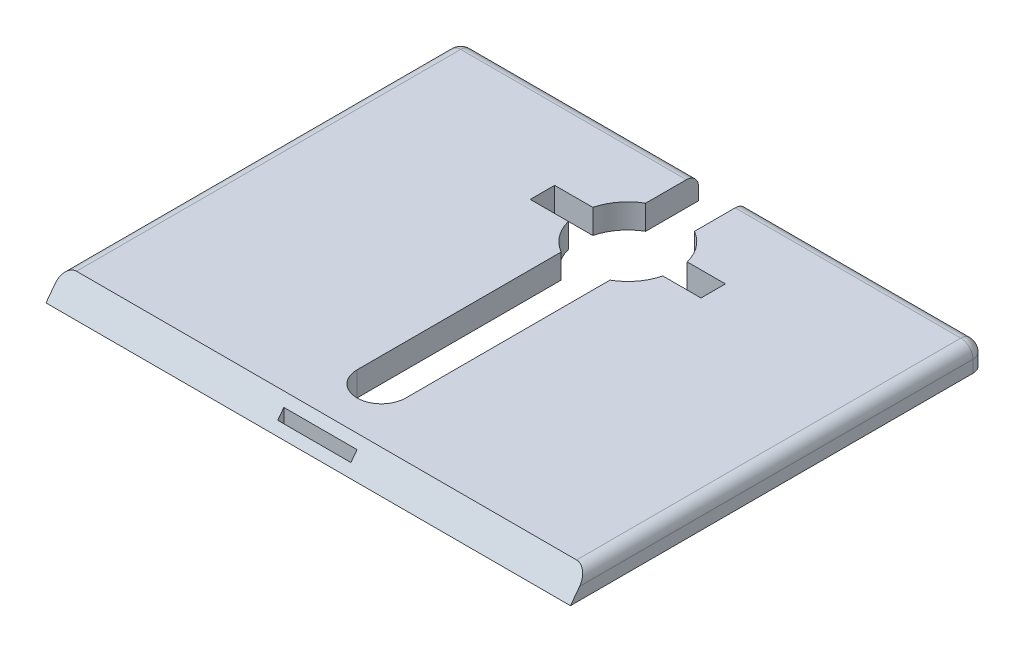
ISO-10303-21;
HEADER;
FILE_DESCRIPTION(('STEP AP214'),'2;1');
FILE_NAME('part.step','',(''),(''),'','','');
FILE_SCHEMA(('AUTOMOTIVE_DESIGN { 1 0 10303 214 1 1 1 1 }'));
ENDSEC;
DATA;
#1=APPLICATION_CONTEXT('core data for automotive mechanical design processes');
#2=APPLICATION_PROTOCOL_DEFINITION('international standard','automotive_design',2000,#1);
#3=PRODUCT_CONTEXT('',#1,'mechanical');
#4=PRODUCT('Part','Part','',(#3));
#5=PRODUCT_RELATED_PRODUCT_CATEGORY('part','',(#4));
#6=PRODUCT_DEFINITION_FORMATION('','',#4);
#7=PRODUCT_DEFINITION_CONTEXT('part definition',#1,'design');
#8=PRODUCT_DEFINITION('design','',#6,#7);
#9=PRODUCT_DEFINITION_SHAPE('','',#8);
#10=(LENGTH_UNIT() NAMED_UNIT(*) SI_UNIT(.MILLI.,.METRE.));
#11=(NAMED_UNIT(*) PLANE_ANGLE_UNIT() SI_UNIT($,.RADIAN.));
#12=(NAMED_UNIT(*) SI_UNIT($,.STERADIAN.) SOLID_ANGLE_UNIT());
#13=UNCERTAINTY_MEASURE_WITH_UNIT(LENGTH_MEASURE(1.E-05),#10,'distance_accuracy_value','');
#14=(GEOMETRIC_REPRESENTATION_CONTEXT(3) GLOBAL_UNCERTAINTY_ASSIGNED_CONTEXT((#13)) GLOBAL_UNIT_ASSIGNED_CONTEXT((#10,
#11,#12)) REPRESENTATION_CONTEXT('',''));
#15=CARTESIAN_POINT('',(0.,0.,0.));
#16=DIRECTION('',(0.,0.,1.));
#17=DIRECTION('',(1.,0.,0.));
#18=AXIS2_PLACEMENT_3D('',#15,#16,#17);
#19=CARTESIAN_POINT('',(-10.75,1.,-8.5));
#20=DIRECTION('',(0.,0.,1.));
#21=DIRECTION('',(1.,0.,0.));
#22=AXIS2_PLACEMENT_3D('',#19,#20,#21);
#23=PLANE('',#22);
#24=DIRECTION('',(-1.,0.,0.));
#25=VECTOR('',#24,1.);
#26=CARTESIAN_POINT('',(-10.75,0.,-8.5));
#27=LINE('',#26,#25);
#28=CARTESIAN_POINT('',(10.25,0.,-8.5));
#29=VERTEX_POINT('',#28);
#30=CARTESIAN_POINT('',(1.,0.,-8.5));
#31=VERTEX_POINT('',#30);
#32=EDGE_CURVE('E437',#29,#31,#27,.T.);
#33=ORIENTED_EDGE('',*,*,#32,.T.);
#34=DIRECTION('',(0.,1.,0.));
#35=VECTOR('',#34,1.);
#36=CARTESIAN_POINT('',(1.,-16.1245154965971,-8.5));
#37=LINE('',#36,#35);
#38=CARTESIAN_POINT('',(1.,0.5,-8.5));
#39=VERTEX_POINT('',#38);
#40=EDGE_CURVE('E273',#31,#39,#37,.T.);
#41=ORIENTED_EDGE('',*,*,#40,.T.);
#42=DIRECTION('',(-1.,0.,0.));
#43=VECTOR('',#42,1.);
#44=CARTESIAN_POINT('',(-10.75,0.5,-8.5));
#45=LINE('',#44,#43);
#46=CARTESIAN_POINT('',(10.25,0.5,-8.5));
#47=VERTEX_POINT('',#46);
#48=EDGE_CURVE('E463',#39,#47,#45,.F.);
#49=ORIENTED_EDGE('',*,*,#48,.T.);
#50=DIRECTION('',(0.,-1.,0.));
#51=VECTOR('',#50,1.);
#52=CARTESIAN_POINT('',(10.25,1.,-8.5));
#53=LINE('',#52,#51);
#54=EDGE_CURVE('E509',#47,#29,#53,.T.);
#55=ORIENTED_EDGE('',*,*,#54,.T.);
#56=EDGE_LOOP('',(#33,#41,#49,#55));
#57=FACE_BOUND('',#56,.T.);
#58=ADVANCED_FACE('F41',(#57),#23,.F.);
#59=CARTESIAN_POINT('',(0.,0.5,-8.));
#60=DIRECTION('',(-1.,0.,0.));
#61=DIRECTION('',(0.,0.,1.));
#62=AXIS2_PLACEMENT_3D('',#59,#60,#61);
#63=CYLINDRICAL_SURFACE('',#62,0.5);
#64=CARTESIAN_POINT('',(-1.,0.5,-8.));
#65=DIRECTION('',(-1.,0.,0.));
#66=DIRECTION('',(0.,0.,1.));
#67=AXIS2_PLACEMENT_3D('',#64,#65,#66);
#68=CIRCLE('',#67,0.5);
#69=CARTESIAN_POINT('',(-1.,0.5,-8.5));
#70=VERTEX_POINT('',#69);
#71=CARTESIAN_POINT('',(-1.,1.,-8.));
#72=VERTEX_POINT('',#71);
#73=EDGE_CURVE('E292',#70,#72,#68,.F.);
#74=ORIENTED_EDGE('',*,*,#73,.F.);
#75=CARTESIAN_POINT('',(-10.25,0.5,-8.5));
#76=VERTEX_POINT('',#75);
#77=EDGE_CURVE('E464',#76,#70,#45,.F.);
#78=ORIENTED_EDGE('',*,*,#77,.F.);
#79=CARTESIAN_POINT('',(-10.25,0.5,-8.));
#80=DIRECTION('',(-1.,0.,0.));
#81=DIRECTION('',(0.,0.,1.));
#82=AXIS2_PLACEMENT_3D('',#79,#80,#81);
#83=CIRCLE('',#82,0.5);
#84=CARTESIAN_POINT('',(-10.25,1.,-8.));
#85=VERTEX_POINT('',#84);
#86=EDGE_CURVE('E495',#76,#85,#83,.F.);
#87=ORIENTED_EDGE('',*,*,#86,.T.);
#88=DIRECTION('',(-1.,0.,0.));
#89=VECTOR('',#88,1.);
#90=CARTESIAN_POINT('',(0.,1.,-8.));
#91=LINE('',#90,#89);
#92=EDGE_CURVE('E451',#72,#85,#91,.T.);
#93=ORIENTED_EDGE('',*,*,#92,.F.);
#94=EDGE_LOOP('',(#74,#78,#87,#93));
#95=FACE_BOUND('',#94,.T.);
#96=ADVANCED_FACE('F625',(#95),#63,.T.);
#97=CARTESIAN_POINT('',(0.,-8.06225774829855,-4.6));
#98=DIRECTION('',(0.,1.,0.));
#99=DIRECTION('',(0.,0.,1.));
#100=AXIS2_PLACEMENT_3D('',#97,#98,#99);
#101=CYLINDRICAL_SURFACE('',#100,2.);
#102=CARTESIAN_POINT('',(0.,1.,-4.6));
#103=DIRECTION('',(0.,1.,0.));
#104=DIRECTION('',(0.,0.,1.));
#105=AXIS2_PLACEMENT_3D('',#102,#103,#104);
#106=CIRCLE('',#105,2.);
#107=CARTESIAN_POINT('',(-1.93649167310371,1.,-4.1));
#108=VERTEX_POINT('',#107);
#109=CARTESIAN_POINT('',(-1.,1.,-2.86794919243112));
#110=VERTEX_POINT('',#109);
#111=EDGE_CURVE('E327',#108,#110,#106,.T.);
#112=ORIENTED_EDGE('',*,*,#111,.T.);
#113=DIRECTION('',(0.,1.,0.));
#114=VECTOR('',#113,1.);
#115=CARTESIAN_POINT('',(-1.,-8.06225774829855,-2.86794919243112));
#116=LINE('',#115,#114);
#117=CARTESIAN_POINT('',(-1.,0.,-2.86794919243112));
#118=VERTEX_POINT('',#117);
#119=EDGE_CURVE('E289',#110,#118,#116,.F.);
#120=ORIENTED_EDGE('',*,*,#119,.T.);
#121=CARTESIAN_POINT('',(0.,0.,-4.6));
#122=DIRECTION('',(0.,-1.,0.));
#123=DIRECTION('',(0.,0.,-1.));
#124=AXIS2_PLACEMENT_3D('',#121,#122,#123);
#125=CIRCLE('',#124,2.);
#126=CARTESIAN_POINT('',(-1.93649167310371,0.,-4.1));
#127=VERTEX_POINT('',#126);
#128=EDGE_CURVE('E261',#127,#118,#125,.F.);
#129=ORIENTED_EDGE('',*,*,#128,.F.);
#130=DIRECTION('',(0.,1.,0.));
#131=VECTOR('',#130,1.);
#132=CARTESIAN_POINT('',(-1.93649167310371,-8.06225774829855,-4.1));
#133=LINE('',#132,#131);
#134=EDGE_CURVE('E342',#127,#108,#133,.T.);
#135=ORIENTED_EDGE('',*,*,#134,.T.);
#136=EDGE_LOOP('',(#112,#120,#129,#135));
#137=FACE_BOUND('',#136,.T.);
#138=ADVANCED_FACE('F642',(#137),#101,.F.);
#139=CARTESIAN_POINT('',(0.,-8.06225774829855,-4.6));
#140=DIRECTION('',(0.,1.,0.));
#141=DIRECTION('',(0.,0.,1.));
#142=AXIS2_PLACEMENT_3D('',#139,#140,#141);
#143=CYLINDRICAL_SURFACE('',#142,2.);
#144=CARTESIAN_POINT('',(0.,0.,-4.6));
#145=DIRECTION('',(0.,-1.,0.));
#146=DIRECTION('',(0.,0.,-1.));
#147=AXIS2_PLACEMENT_3D('',#144,#145,#146);
#148=CIRCLE('',#147,2.);
#149=CARTESIAN_POINT('',(-1.,0.,-6.33205080756888));
#150=VERTEX_POINT('',#149);
#151=CARTESIAN_POINT('',(-1.93649167310371,0.,-5.1));
#152=VERTEX_POINT('',#151);
#153=EDGE_CURVE('E317',#150,#152,#148,.F.);
#154=ORIENTED_EDGE('',*,*,#153,.F.);
#155=DIRECTION('',(0.,1.,0.));
#156=VECTOR('',#155,1.);
#157=CARTESIAN_POINT('',(-1.,-8.06225774829855,-6.33205080756888));
#158=LINE('',#157,#156);
#159=CARTESIAN_POINT('',(-1.,1.,-6.33205080756888));
#160=VERTEX_POINT('',#159);
#161=EDGE_CURVE('E11',#150,#160,#158,.T.);
#162=ORIENTED_EDGE('',*,*,#161,.T.);
#163=CARTESIAN_POINT('',(0.,1.,-4.6));
#164=DIRECTION('',(0.,1.,0.));
#165=DIRECTION('',(0.,0.,1.));
#166=AXIS2_PLACEMENT_3D('',#163,#164,#165);
#167=CIRCLE('',#166,2.);
#168=CARTESIAN_POINT('',(-1.93649167310371,1.,-5.1));
#169=VERTEX_POINT('',#168);
#170=EDGE_CURVE('E312',#160,#169,#167,.T.);
#171=ORIENTED_EDGE('',*,*,#170,.T.);
#172=DIRECTION('',(0.,1.,0.));
#173=VECTOR('',#172,1.);
#174=CARTESIAN_POINT('',(-1.93649167310371,-8.06225774829855,-5.1));
#175=LINE('',#174,#173);
#176=EDGE_CURVE('E353',#152,#169,#175,.T.);
#177=ORIENTED_EDGE('',*,*,#176,.F.);
#178=EDGE_LOOP('',(#154,#162,#171,#177));
#179=FACE_BOUND('',#178,.T.);
#180=ADVANCED_FACE('F565',(#179),#143,.F.);
#181=CARTESIAN_POINT('',(10.75,1.,8.5));
#182=DIRECTION('',(-1.,0.,0.));
#183=DIRECTION('',(0.,0.,1.));
#184=AXIS2_PLACEMENT_3D('',#181,#182,#183);
#185=PLANE('',#184);
#186=DIRECTION('',(0.,0.,-1.));
#187=VECTOR('',#186,1.);
#188=CARTESIAN_POINT('',(10.75,0.,8.5));
#189=LINE('',#188,#187);
#190=CARTESIAN_POINT('',(10.75,0.,8.50000000000004));
#191=VERTEX_POINT('',#190);
#192=CARTESIAN_POINT('',(10.75,0.,-8.));
#193=VERTEX_POINT('',#192);
#194=EDGE_CURVE('E432',#191,#193,#189,.T.);
#195=ORIENTED_EDGE('',*,*,#194,.T.);
#196=DIRECTION('',(0.,-1.,0.));
#197=VECTOR('',#196,1.);
#198=CARTESIAN_POINT('',(10.75,1.,-8.));
#199=LINE('',#198,#197);
#200=CARTESIAN_POINT('',(10.75,0.5,-8.));
#201=VERTEX_POINT('',#200);
#202=EDGE_CURVE('E519',#193,#201,#199,.F.);
#203=ORIENTED_EDGE('',*,*,#202,.T.);
#204=DIRECTION('',(0.,0.,-1.));
#205=VECTOR('',#204,1.);
#206=CARTESIAN_POINT('',(10.75,0.5,8.5));
#207=LINE('',#206,#205);
#208=CARTESIAN_POINT('',(10.75,0.5,8.12500000000004));
#209=VERTEX_POINT('',#208);
#210=EDGE_CURVE('E460',#201,#209,#207,.F.);
#211=ORIENTED_EDGE('',*,*,#210,.T.);
#212=DIRECTION('',(0.,0.8,-0.6));
#213=VECTOR('',#212,1.);
#214=CARTESIAN_POINT('',(10.75,0.,8.50000000000004));
#215=LINE('',#214,#213);
#216=EDGE_CURVE('E419',#191,#209,#215,.T.);
#217=ORIENTED_EDGE('',*,*,#216,.F.);
#218=EDGE_LOOP('',(#195,#203,#211,#217));
#219=FACE_BOUND('',#218,.T.);
#220=ADVANCED_FACE('F634',(#219),#185,.F.);
#221=ORIENTED_EDGE('',*,*,#77,.T.);
#222=DIRECTION('',(0.,1.,0.));
#223=VECTOR('',#222,1.);
#224=CARTESIAN_POINT('',(-1.,-16.1245154965971,-8.5));
#225=LINE('',#224,#223);
#226=CARTESIAN_POINT('',(-1.,0.,-8.5));
#227=VERTEX_POINT('',#226);
#228=EDGE_CURVE('E278',#227,#70,#225,.T.);
#229=ORIENTED_EDGE('',*,*,#228,.F.);
#230=CARTESIAN_POINT('',(-10.25,0.,-8.5));
#231=VERTEX_POINT('',#230);
#232=EDGE_CURVE('E436',#227,#231,#27,.T.);
#233=ORIENTED_EDGE('',*,*,#232,.T.);
#234=DIRECTION('',(0.,-1.,0.));
#235=VECTOR('',#234,1.);
#236=CARTESIAN_POINT('',(-10.25,1.,-8.5));
#237=LINE('',#236,#235);
#238=EDGE_CURVE('E506',#231,#76,#237,.F.);
#239=ORIENTED_EDGE('',*,*,#238,.T.);
#240=EDGE_LOOP('',(#221,#229,#233,#239));
#241=FACE_BOUND('',#240,.T.);
#242=ADVANCED_FACE('F628',(#241),#23,.F.);
#243=CARTESIAN_POINT('',(-10.75,1.,8.5));
#244=DIRECTION('',(1.,0.,0.));
#245=DIRECTION('',(0.,0.,-1.));
#246=AXIS2_PLACEMENT_3D('',#243,#244,#245);
#247=PLANE('',#246);
#248=DIRECTION('',(0.,0.,1.));
#249=VECTOR('',#248,1.);
#250=CARTESIAN_POINT('',(-10.75,0.5,8.5));
#251=LINE('',#250,#249);
#252=CARTESIAN_POINT('',(-10.75,0.5,8.12500000000004));
#253=VERTEX_POINT('',#252);
#254=CARTESIAN_POINT('',(-10.75,0.5,-8.));
#255=VERTEX_POINT('',#254);
#256=EDGE_CURVE('E468',#253,#255,#251,.F.);
#257=ORIENTED_EDGE('',*,*,#256,.T.);
#258=DIRECTION('',(0.,-1.,0.));
#259=VECTOR('',#258,1.);
#260=CARTESIAN_POINT('',(-10.75,1.,-8.));
#261=LINE('',#260,#259);
#262=CARTESIAN_POINT('',(-10.75,0.,-8.));
#263=VERTEX_POINT('',#262);
#264=EDGE_CURVE('E522',#255,#263,#261,.T.);
#265=ORIENTED_EDGE('',*,*,#264,.T.);
#266=DIRECTION('',(0.,0.,1.));
#267=VECTOR('',#266,1.);
#268=CARTESIAN_POINT('',(-10.75,0.,8.5));
#269=LINE('',#268,#267);
#270=CARTESIAN_POINT('',(-10.75,0.,8.50000000000004));
#271=VERTEX_POINT('',#270);
#272=EDGE_CURVE('E441',#263,#271,#269,.T.);
#273=ORIENTED_EDGE('',*,*,#272,.T.);
#274=DIRECTION('',(0.,-0.8,0.6));
#275=VECTOR('',#274,1.);
#276=CARTESIAN_POINT('',(-10.75,0.,8.50000000000004));
#277=LINE('',#276,#275);
#278=EDGE_CURVE('E418',#253,#271,#277,.T.);
#279=ORIENTED_EDGE('',*,*,#278,.F.);
#280=EDGE_LOOP('',(#257,#265,#273,#279));
#281=FACE_BOUND('',#280,.T.);
#282=ADVANCED_FACE('F614',(#281),#247,.F.);
#283=CARTESIAN_POINT('',(0.,1.,0.));
#284=DIRECTION('',(0.,-1.,0.));
#285=DIRECTION('',(0.,0.,-1.));
#286=AXIS2_PLACEMENT_3D('',#283,#284,#285);
#287=PLANE('',#286);
#288=ORIENTED_EDGE('',*,*,#170,.F.);
#289=DIRECTION('',(0.,0.,1.));
#290=VECTOR('',#289,1.);
#291=CARTESIAN_POINT('',(-1.,1.,-8.5));
#292=LINE('',#291,#290);
#293=EDGE_CURVE('E555',#72,#160,#292,.T.);
#294=ORIENTED_EDGE('',*,*,#293,.F.);
#295=ORIENTED_EDGE('',*,*,#92,.T.);
#296=DIRECTION('',(0.,0.,1.));
#297=VECTOR('',#296,1.);
#298=CARTESIAN_POINT('',(-10.25,1.,0.));
#299=LINE('',#298,#297);
#300=CARTESIAN_POINT('',(-10.25,1.,7.75000000000004));
#301=VERTEX_POINT('',#300);
#302=EDGE_CURVE('E447',#85,#301,#299,.T.);
#303=ORIENTED_EDGE('',*,*,#302,.T.);
#304=DIRECTION('',(-1.,0.,0.));
#305=VECTOR('',#304,1.);
#306=CARTESIAN_POINT('',(12.,1.,7.75000000000004));
#307=LINE('',#306,#305);
#308=CARTESIAN_POINT('',(10.25,1.,7.75000000000004));
#309=VERTEX_POINT('',#308);
#310=EDGE_CURVE('E424',#309,#301,#307,.T.);
#311=ORIENTED_EDGE('',*,*,#310,.F.);
#312=DIRECTION('',(0.,0.,-1.));
#313=VECTOR('',#312,1.);
#314=CARTESIAN_POINT('',(10.25,1.,0.));
#315=LINE('',#314,#313);
#316=CARTESIAN_POINT('',(10.25,1.,-8.));
#317=VERTEX_POINT('',#316);
#318=EDGE_CURVE('E456',#309,#317,#315,.T.);
#319=ORIENTED_EDGE('',*,*,#318,.T.);
#320=CARTESIAN_POINT('',(1.,1.,-8.));
#321=VERTEX_POINT('',#320);
#322=EDGE_CURVE('E452',#317,#321,#91,.T.);
#323=ORIENTED_EDGE('',*,*,#322,.T.);
#324=DIRECTION('',(0.,0.,-1.));
#325=VECTOR('',#324,1.);
#326=CARTESIAN_POINT('',(1.,1.,-8.5));
#327=LINE('',#326,#325);
#328=CARTESIAN_POINT('',(1.,1.,-6.33205080756888));
#329=VERTEX_POINT('',#328);
#330=EDGE_CURVE('E266',#329,#321,#327,.T.);
#331=ORIENTED_EDGE('',*,*,#330,.F.);
#332=CARTESIAN_POINT('',(1.93649167310371,1.,-5.1));
#333=VERTEX_POINT('',#332);
#334=EDGE_CURVE('E307',#333,#329,#167,.T.);
#335=ORIENTED_EDGE('',*,*,#334,.F.);
#336=DIRECTION('',(1.,0.,0.));
#337=VECTOR('',#336,1.);
#338=CARTESIAN_POINT('',(0.,1.,-5.1));
#339=LINE('',#338,#337);
#340=CARTESIAN_POINT('',(3.5,1.,-5.1));
#341=VERTEX_POINT('',#340);
#342=EDGE_CURVE('E313',#333,#341,#339,.T.);
#343=ORIENTED_EDGE('',*,*,#342,.T.);
#344=DIRECTION('',(0.,0.,-1.));
#345=VECTOR('',#344,1.);
#346=CARTESIAN_POINT('',(3.5,1.,0.));
#347=LINE('',#346,#345);
#348=CARTESIAN_POINT('',(3.5,1.,-4.1));
#349=VERTEX_POINT('',#348);
#350=EDGE_CURVE('E319',#349,#341,#347,.T.);
#351=ORIENTED_EDGE('',*,*,#350,.F.);
#352=DIRECTION('',(1.,0.,0.));
#353=VECTOR('',#352,1.);
#354=CARTESIAN_POINT('',(0.,1.,-4.1));
#355=LINE('',#354,#353);
#356=CARTESIAN_POINT('',(1.93649167310371,1.,-4.1));
#357=VERTEX_POINT('',#356);
#358=EDGE_CURVE('E323',#357,#349,#355,.T.);
#359=ORIENTED_EDGE('',*,*,#358,.F.);
#360=CARTESIAN_POINT('',(1.,1.,-2.86794919243112));
#361=VERTEX_POINT('',#360);
#362=EDGE_CURVE('E331',#361,#357,#106,.T.);
#363=ORIENTED_EDGE('',*,*,#362,.F.);
#364=CARTESIAN_POINT('',(1.,1.,5.5));
#365=VERTEX_POINT('',#364);
#366=EDGE_CURVE('E57',#365,#361,#327,.T.);
#367=ORIENTED_EDGE('',*,*,#366,.F.);
#368=CARTESIAN_POINT('',(0.,1.,5.5));
#369=DIRECTION('',(0.,1.,0.));
#370=DIRECTION('',(0.,0.,1.));
#371=AXIS2_PLACEMENT_3D('',#368,#369,#370);
#372=CIRCLE('',#371,1.);
#373=CARTESIAN_POINT('',(-1.,1.,5.5));
#374=VERTEX_POINT('',#373);
#375=EDGE_CURVE('E553',#374,#365,#372,.T.);
#376=ORIENTED_EDGE('',*,*,#375,.F.);
#377=EDGE_CURVE('E251',#110,#374,#292,.T.);
#378=ORIENTED_EDGE('',*,*,#377,.F.);
#379=ORIENTED_EDGE('',*,*,#111,.F.);
#380=DIRECTION('',(1.,0.,0.));
#381=VECTOR('',#380,1.);
#382=CARTESIAN_POINT('',(0.,1.,-4.1));
#383=LINE('',#382,#381);
#384=CARTESIAN_POINT('',(-3.5,1.,-4.1));
#385=VERTEX_POINT('',#384);
#386=EDGE_CURVE('E332',#385,#108,#383,.T.);
#387=ORIENTED_EDGE('',*,*,#386,.F.);
#388=DIRECTION('',(0.,0.,-1.));
#389=VECTOR('',#388,1.);
#390=CARTESIAN_POINT('',(-3.5,1.,0.));
#391=LINE('',#390,#389);
#392=CARTESIAN_POINT('',(-3.5,1.,-5.1));
#393=VERTEX_POINT('',#392);
#394=EDGE_CURVE('E296',#385,#393,#391,.T.);
#395=ORIENTED_EDGE('',*,*,#394,.T.);
#396=DIRECTION('',(1.,0.,0.));
#397=VECTOR('',#396,1.);
#398=CARTESIAN_POINT('',(0.,1.,-5.1));
#399=LINE('',#398,#397);
#400=EDGE_CURVE('E302',#393,#169,#399,.T.);
#401=ORIENTED_EDGE('',*,*,#400,.T.);
#402=EDGE_LOOP('',(#288,#294,#295,#303,#311,#319,#323,#331,#335,#343,#351,#359,#363,#367,#376,
#378,#379,#387,#395,#401));
#403=FACE_BOUND('',#402,.T.);
#404=ADVANCED_FACE('F549',(#403),#287,.F.);
#405=CARTESIAN_POINT('',(0.,0.,0.));
#406=DIRECTION('',(0.,-1.,0.));
#407=DIRECTION('',(0.,0.,-1.));
#408=AXIS2_PLACEMENT_3D('',#405,#406,#407);
#409=PLANE('',#408);
#410=DIRECTION('',(0.,0.,1.));
#411=VECTOR('',#410,1.);
#412=CARTESIAN_POINT('',(-1.,0.,-8.5));
#413=LINE('',#412,#411);
#414=EDGE_CURVE('E253',#227,#150,#413,.T.);
#415=ORIENTED_EDGE('',*,*,#414,.T.);
#416=ORIENTED_EDGE('',*,*,#153,.T.);
#417=DIRECTION('',(1.,0.,0.));
#418=VECTOR('',#417,1.);
#419=CARTESIAN_POINT('',(0.,0.,-5.1));
#420=LINE('',#419,#418);
#421=CARTESIAN_POINT('',(-3.5,0.,-5.1));
#422=VERTEX_POINT('',#421);
#423=EDGE_CURVE('E345',#422,#152,#420,.T.);
#424=ORIENTED_EDGE('',*,*,#423,.F.);
#425=DIRECTION('',(0.,0.,-1.));
#426=VECTOR('',#425,1.);
#427=CARTESIAN_POINT('',(-3.5,0.,0.));
#428=LINE('',#427,#426);
#429=CARTESIAN_POINT('',(-3.5,0.,-4.1));
#430=VERTEX_POINT('',#429);
#431=EDGE_CURVE('E295',#430,#422,#428,.T.);
#432=ORIENTED_EDGE('',*,*,#431,.F.);
#433=DIRECTION('',(1.,0.,0.));
#434=VECTOR('',#433,1.);
#435=CARTESIAN_POINT('',(0.,0.,-4.1));
#436=LINE('',#435,#434);
#437=EDGE_CURVE('E300',#430,#127,#436,.T.);
#438=ORIENTED_EDGE('',*,*,#437,.T.);
#439=ORIENTED_EDGE('',*,*,#128,.T.);
#440=CARTESIAN_POINT('',(-1.,0.,5.5));
#441=VERTEX_POINT('',#440);
#442=EDGE_CURVE('E248',#118,#441,#413,.T.);
#443=ORIENTED_EDGE('',*,*,#442,.T.);
#444=CARTESIAN_POINT('',(0.,0.,5.5));
#445=DIRECTION('',(0.,-1.,0.));
#446=DIRECTION('',(0.,0.,-1.));
#447=AXIS2_PLACEMENT_3D('',#444,#445,#446);
#448=CIRCLE('',#447,1.);
#449=CARTESIAN_POINT('',(1.,0.,5.5));
#450=VERTEX_POINT('',#449);
#451=EDGE_CURVE('E234',#441,#450,#448,.F.);
#452=ORIENTED_EDGE('',*,*,#451,.T.);
#453=DIRECTION('',(0.,0.,-1.));
#454=VECTOR('',#453,1.);
#455=CARTESIAN_POINT('',(1.,0.,-8.5));
#456=LINE('',#455,#454);
#457=CARTESIAN_POINT('',(1.,0.,-2.86794919243112));
#458=VERTEX_POINT('',#457);
#459=EDGE_CURVE('E271',#450,#458,#456,.T.);
#460=ORIENTED_EDGE('',*,*,#459,.T.);
#461=CARTESIAN_POINT('',(1.93649167310371,0.,-4.1));
#462=VERTEX_POINT('',#461);
#463=EDGE_CURVE('E311',#458,#462,#125,.F.);
#464=ORIENTED_EDGE('',*,*,#463,.T.);
#465=DIRECTION('',(1.,0.,0.));
#466=VECTOR('',#465,1.);
#467=CARTESIAN_POINT('',(0.,0.,-4.1));
#468=LINE('',#467,#466);
#469=CARTESIAN_POINT('',(3.5,0.,-4.1));
#470=VERTEX_POINT('',#469);
#471=EDGE_CURVE('E362',#462,#470,#468,.T.);
#472=ORIENTED_EDGE('',*,*,#471,.T.);
#473=DIRECTION('',(0.,0.,-1.));
#474=VECTOR('',#473,1.);
#475=CARTESIAN_POINT('',(3.5,0.,0.));
#476=LINE('',#475,#474);
#477=CARTESIAN_POINT('',(3.5,0.,-5.1));
#478=VERTEX_POINT('',#477);
#479=EDGE_CURVE('E356',#470,#478,#476,.T.);
#480=ORIENTED_EDGE('',*,*,#479,.T.);
#481=DIRECTION('',(1.,0.,0.));
#482=VECTOR('',#481,1.);
#483=CARTESIAN_POINT('',(0.,0.,-5.1));
#484=LINE('',#483,#482);
#485=CARTESIAN_POINT('',(1.93649167310371,0.,-5.1));
#486=VERTEX_POINT('',#485);
#487=EDGE_CURVE('E336',#486,#478,#484,.T.);
#488=ORIENTED_EDGE('',*,*,#487,.F.);
#489=CARTESIAN_POINT('',(1.,0.,-6.33205080756888));
#490=VERTEX_POINT('',#489);
#491=EDGE_CURVE('E349',#486,#490,#148,.F.);
#492=ORIENTED_EDGE('',*,*,#491,.T.);
#493=EDGE_CURVE('E65',#490,#31,#456,.T.);
#494=ORIENTED_EDGE('',*,*,#493,.T.);
#495=ORIENTED_EDGE('',*,*,#32,.F.);
#496=CARTESIAN_POINT('',(10.25,0.,-8.));
#497=DIRECTION('',(0.,-1.,0.));
#498=DIRECTION('',(0.,0.,-1.));
#499=AXIS2_PLACEMENT_3D('',#496,#497,#498);
#500=CIRCLE('',#499,0.5);
#501=EDGE_CURVE('E516',#29,#193,#500,.T.);
#502=ORIENTED_EDGE('',*,*,#501,.T.);
#503=ORIENTED_EDGE('',*,*,#194,.F.);
#504=DIRECTION('',(1.,0.,0.));
#505=VECTOR('',#504,1.);
#506=CARTESIAN_POINT('',(-10.75,0.,8.5));
#507=LINE('',#506,#505);
#508=EDGE_CURVE('E444',#271,#191,#507,.T.);
#509=ORIENTED_EDGE('',*,*,#508,.F.);
#510=ORIENTED_EDGE('',*,*,#272,.F.);
#511=CARTESIAN_POINT('',(-10.25,0.,-8.));
#512=DIRECTION('',(0.,-1.,0.));
#513=DIRECTION('',(0.,0.,-1.));
#514=AXIS2_PLACEMENT_3D('',#511,#512,#513);
#515=CIRCLE('',#514,0.5);
#516=EDGE_CURVE('E512',#263,#231,#515,.T.);
#517=ORIENTED_EDGE('',*,*,#516,.T.);
#518=ORIENTED_EDGE('',*,*,#232,.F.);
#519=EDGE_LOOP('',(#415,#416,#424,#432,#438,#439,#443,#452,#460,#464,#472,#480,#488,#492,#494,
#495,#502,#503,#509,#510,#517,#518));
#520=FACE_BOUND('',#519,.T.);
#521=DIRECTION('',(-1.,0.,0.));
#522=VECTOR('',#521,1.);
#523=CARTESIAN_POINT('',(-1.5,0.,8.00000000000004));
#524=LINE('',#523,#522);
#525=CARTESIAN_POINT('',(1.5,0.,8.00000000000004));
#526=VERTEX_POINT('',#525);
#527=CARTESIAN_POINT('',(-1.5,0.,8.00000000000004));
#528=VERTEX_POINT('',#527);
#529=EDGE_CURVE('E386',#526,#528,#524,.T.);
#530=ORIENTED_EDGE('',*,*,#529,.T.);
#531=DIRECTION('',(0.,0.,1.));
#532=VECTOR('',#531,1.);
#533=CARTESIAN_POINT('',(-1.5,0.,8.25000000000004));
#534=LINE('',#533,#532);
#535=CARTESIAN_POINT('',(-1.5,0.,8.25000000000004));
#536=VERTEX_POINT('',#535);
#537=EDGE_CURVE('E403',#528,#536,#534,.T.);
#538=ORIENTED_EDGE('',*,*,#537,.T.);
#539=DIRECTION('',(1.,0.,0.));
#540=VECTOR('',#539,1.);
#541=CARTESIAN_POINT('',(-1.5,0.,8.25000000000004));
#542=LINE('',#541,#540);
#543=CARTESIAN_POINT('',(1.5,0.,8.25000000000004));
#544=VERTEX_POINT('',#543);
#545=EDGE_CURVE('E398',#536,#544,#542,.T.);
#546=ORIENTED_EDGE('',*,*,#545,.T.);
#547=DIRECTION('',(0.,0.,-1.));
#548=VECTOR('',#547,1.);
#549=CARTESIAN_POINT('',(1.5,0.,8.25000000000004));
#550=LINE('',#549,#548);
#551=EDGE_CURVE('E392',#544,#526,#550,.T.);
#552=ORIENTED_EDGE('',*,*,#551,.T.);
#553=EDGE_LOOP('',(#530,#538,#546,#552));
#554=FACE_BOUND('',#553,.T.);
#555=ADVANCED_FACE('F257',(#520,#554),#409,.T.);
#556=CARTESIAN_POINT('',(-10.25,0.5,0.));
#557=DIRECTION('',(0.,0.,1.));
#558=DIRECTION('',(1.,0.,0.));
#559=AXIS2_PLACEMENT_3D('',#556,#557,#558);
#560=CYLINDRICAL_SURFACE('',#559,0.5);
#561=ORIENTED_EDGE('',*,*,#302,.F.);
#562=CARTESIAN_POINT('',(-10.25,0.5,-8.));
#563=DIRECTION('',(0.,0.,1.));
#564=DIRECTION('',(1.,0.,0.));
#565=AXIS2_PLACEMENT_3D('',#562,#563,#564);
#566=CIRCLE('',#565,0.5);
#567=EDGE_CURVE('E503',#85,#255,#566,.T.);
#568=ORIENTED_EDGE('',*,*,#567,.T.);
#569=ORIENTED_EDGE('',*,*,#256,.F.);
#570=CARTESIAN_POINT('',(-10.25,0.5,8.12500000000004));
#571=DIRECTION('',(0.,-0.6,-0.8));
#572=DIRECTION('',(0.,-0.8,0.6));
#573=AXIS2_PLACEMENT_3D('',#570,#571,#572);
#574=ELLIPSE('',#573,0.625,0.5);
#575=EDGE_CURVE('E423',#301,#253,#574,.F.);
#576=ORIENTED_EDGE('',*,*,#575,.F.);
#577=EDGE_LOOP('',(#561,#568,#569,#576));
#578=FACE_BOUND('',#577,.T.);
#579=ADVANCED_FACE('F610',(#578),#560,.T.);
#580=CARTESIAN_POINT('',(1.,0.5,-8.));
#581=DIRECTION('',(1.,0.,0.));
#582=DIRECTION('',(0.,0.,-1.));
#583=AXIS2_PLACEMENT_3D('',#580,#581,#582);
#584=CIRCLE('',#583,0.5);
#585=EDGE_CURVE('E286',#321,#39,#584,.F.);
#586=ORIENTED_EDGE('',*,*,#585,.F.);
#587=ORIENTED_EDGE('',*,*,#322,.F.);
#588=CARTESIAN_POINT('',(10.25,0.5,-8.));
#589=DIRECTION('',(-1.,0.,0.));
#590=DIRECTION('',(0.,0.,1.));
#591=AXIS2_PLACEMENT_3D('',#588,#589,#590);
#592=CIRCLE('',#591,0.5);
#593=EDGE_CURVE('E499',#317,#47,#592,.T.);
#594=ORIENTED_EDGE('',*,*,#593,.T.);
#595=ORIENTED_EDGE('',*,*,#48,.F.);
#596=EDGE_LOOP('',(#586,#587,#594,#595));
#597=FACE_BOUND('',#596,.T.);
#598=ADVANCED_FACE('F588',(#597),#63,.T.);
#599=CARTESIAN_POINT('',(10.25,0.5,0.));
#600=DIRECTION('',(0.,0.,-1.));
#601=DIRECTION('',(-1.,0.,0.));
#602=AXIS2_PLACEMENT_3D('',#599,#600,#601);
#603=CYLINDRICAL_SURFACE('',#602,0.5);
#604=ORIENTED_EDGE('',*,*,#210,.F.);
#605=CARTESIAN_POINT('',(10.25,0.5,-8.));
#606=DIRECTION('',(0.,0.,-1.));
#607=DIRECTION('',(-1.,0.,0.));
#608=AXIS2_PLACEMENT_3D('',#605,#606,#607);
#609=CIRCLE('',#608,0.5);
#610=EDGE_CURVE('E491',#201,#317,#609,.F.);
#611=ORIENTED_EDGE('',*,*,#610,.T.);
#612=ORIENTED_EDGE('',*,*,#318,.F.);
#613=CARTESIAN_POINT('',(10.25,0.5,8.12500000000004));
#614=DIRECTION('',(0.,-0.6,-0.8));
#615=DIRECTION('',(0.,0.8,-0.6));
#616=AXIS2_PLACEMENT_3D('',#613,#614,#615);
#617=ELLIPSE('',#616,0.625,0.5);
#618=EDGE_CURVE('E472',#209,#309,#617,.F.);
#619=ORIENTED_EDGE('',*,*,#618,.F.);
#620=EDGE_LOOP('',(#604,#611,#612,#619));
#621=FACE_BOUND('',#620,.T.);
#622=ADVANCED_FACE('F600',(#621),#603,.T.);
#623=CARTESIAN_POINT('',(12.,0.,8.50000000000004));
#624=DIRECTION('',(0.,-0.6,-0.8));
#625=DIRECTION('',(0.,0.8,-0.6));
#626=AXIS2_PLACEMENT_3D('',#623,#624,#625);
#627=PLANE('',#626);
#628=DIRECTION('',(0.,0.8,-0.6));
#629=VECTOR('',#628,1.);
#630=CARTESIAN_POINT('',(-1.5,0.,8.50000000000004));
#631=LINE('',#630,#629);
#632=CARTESIAN_POINT('',(-1.5,0.333333333333334,8.25000000000004));
#633=VERTEX_POINT('',#632);
#634=CARTESIAN_POINT('',(-1.5,0.666666666666668,8.00000000000004));
#635=VERTEX_POINT('',#634);
#636=EDGE_CURVE('E483',#633,#635,#631,.T.);
#637=ORIENTED_EDGE('',*,*,#636,.T.);
#638=DIRECTION('',(1.,0.,0.));
#639=VECTOR('',#638,1.);
#640=CARTESIAN_POINT('',(12.,0.666666666666667,8.00000000000004));
#641=LINE('',#640,#639);
#642=CARTESIAN_POINT('',(1.5,0.666666666666668,8.00000000000004));
#643=VERTEX_POINT('',#642);
#644=EDGE_CURVE('E487',#635,#643,#641,.T.);
#645=ORIENTED_EDGE('',*,*,#644,.T.);
#646=DIRECTION('',(0.,-0.8,0.6));
#647=VECTOR('',#646,1.);
#648=CARTESIAN_POINT('',(1.5,0.,8.50000000000004));
#649=LINE('',#648,#647);
#650=CARTESIAN_POINT('',(1.5,0.333333333333334,8.25000000000004));
#651=VERTEX_POINT('',#650);
#652=EDGE_CURVE('E475',#643,#651,#649,.T.);
#653=ORIENTED_EDGE('',*,*,#652,.T.);
#654=DIRECTION('',(-1.,0.,0.));
#655=VECTOR('',#654,1.);
#656=CARTESIAN_POINT('',(12.,0.333333333333334,8.25000000000004));
#657=LINE('',#656,#655);
#658=EDGE_CURVE('E479',#651,#633,#657,.T.);
#659=ORIENTED_EDGE('',*,*,#658,.T.);
#660=EDGE_LOOP('',(#637,#645,#653,#659));
#661=FACE_BOUND('',#660,.T.);
#662=ORIENTED_EDGE('',*,*,#575,.T.);
#663=ORIENTED_EDGE('',*,*,#278,.T.);
#664=ORIENTED_EDGE('',*,*,#508,.T.);
#665=ORIENTED_EDGE('',*,*,#216,.T.);
#666=ORIENTED_EDGE('',*,*,#618,.T.);
#667=ORIENTED_EDGE('',*,*,#310,.T.);
#668=EDGE_LOOP('',(#662,#663,#664,#665,#666,#667));
#669=FACE_BOUND('',#668,.T.);
#670=ADVANCED_FACE('F606',(#661,#669),#627,.F.);
#671=CARTESIAN_POINT('',(-1.5,-3.01039864469807,8.00000000000004));
#672=DIRECTION('',(0.,0.,-1.));
#673=DIRECTION('',(-1.,0.,0.));
#674=AXIS2_PLACEMENT_3D('',#671,#672,#673);
#675=PLANE('',#674);
#676=DIRECTION('',(0.,1.,0.));
#677=VECTOR('',#676,1.);
#678=CARTESIAN_POINT('',(-1.5,-3.01039864469807,8.00000000000004));
#679=LINE('',#678,#677);
#680=EDGE_CURVE('E390',#528,#635,#679,.T.);
#681=ORIENTED_EDGE('',*,*,#680,.F.);
#682=ORIENTED_EDGE('',*,*,#529,.F.);
#683=DIRECTION('',(0.,1.,0.));
#684=VECTOR('',#683,1.);
#685=CARTESIAN_POINT('',(1.5,-3.01039864469807,8.00000000000004));
#686=LINE('',#685,#684);
#687=EDGE_CURVE('E396',#526,#643,#686,.T.);
#688=ORIENTED_EDGE('',*,*,#687,.T.);
#689=ORIENTED_EDGE('',*,*,#644,.F.);
#690=EDGE_LOOP('',(#681,#682,#688,#689));
#691=FACE_BOUND('',#690,.T.);
#692=ADVANCED_FACE('F659',(#691),#675,.F.);
#693=CARTESIAN_POINT('',(-1.5,-3.01039864469807,8.25000000000004));
#694=DIRECTION('',(-1.,0.,0.));
#695=DIRECTION('',(0.,0.,1.));
#696=AXIS2_PLACEMENT_3D('',#693,#694,#695);
#697=PLANE('',#696);
#698=DIRECTION('',(0.,1.,0.));
#699=VECTOR('',#698,1.);
#700=CARTESIAN_POINT('',(-1.5,-3.01039864469807,8.25000000000004));
#701=LINE('',#700,#699);
#702=EDGE_CURVE('E402',#536,#633,#701,.T.);
#703=ORIENTED_EDGE('',*,*,#702,.F.);
#704=ORIENTED_EDGE('',*,*,#537,.F.);
#705=ORIENTED_EDGE('',*,*,#680,.T.);
#706=ORIENTED_EDGE('',*,*,#636,.F.);
#707=EDGE_LOOP('',(#703,#704,#705,#706));
#708=FACE_BOUND('',#707,.T.);
#709=ADVANCED_FACE('F663',(#708),#697,.F.);
#710=CARTESIAN_POINT('',(-1.5,-3.01039864469807,8.25000000000004));
#711=DIRECTION('',(0.,0.,1.));
#712=DIRECTION('',(1.,0.,0.));
#713=AXIS2_PLACEMENT_3D('',#710,#711,#712);
#714=PLANE('',#713);
#715=DIRECTION('',(0.,1.,0.));
#716=VECTOR('',#715,1.);
#717=CARTESIAN_POINT('',(1.5,-3.01039864469807,8.25000000000004));
#718=LINE('',#717,#716);
#719=EDGE_CURVE('E397',#544,#651,#718,.T.);
#720=ORIENTED_EDGE('',*,*,#719,.F.);
#721=ORIENTED_EDGE('',*,*,#545,.F.);
#722=ORIENTED_EDGE('',*,*,#702,.T.);
#723=ORIENTED_EDGE('',*,*,#658,.F.);
#724=EDGE_LOOP('',(#720,#721,#722,#723));
#725=FACE_BOUND('',#724,.T.);
#726=ADVANCED_FACE('F667',(#725),#714,.F.);
#727=CARTESIAN_POINT('',(1.5,-3.01039864469807,8.25000000000004));
#728=DIRECTION('',(1.,0.,0.));
#729=DIRECTION('',(0.,0.,-1.));
#730=AXIS2_PLACEMENT_3D('',#727,#728,#729);
#731=PLANE('',#730);
#732=ORIENTED_EDGE('',*,*,#687,.F.);
#733=ORIENTED_EDGE('',*,*,#551,.F.);
#734=ORIENTED_EDGE('',*,*,#719,.T.);
#735=ORIENTED_EDGE('',*,*,#652,.F.);
#736=EDGE_LOOP('',(#732,#733,#734,#735));
#737=FACE_BOUND('',#736,.T.);
#738=ADVANCED_FACE('F671',(#737),#731,.F.);
#739=CARTESIAN_POINT('',(10.25,1.,-8.));
#740=DIRECTION('',(0.,-1.,0.));
#741=DIRECTION('',(0.,0.,-1.));
#742=AXIS2_PLACEMENT_3D('',#739,#740,#741);
#743=CYLINDRICAL_SURFACE('',#742,0.5);
#744=ORIENTED_EDGE('',*,*,#501,.F.);
#745=ORIENTED_EDGE('',*,*,#54,.F.);
#746=CARTESIAN_POINT('',(10.25,0.5,-8.));
#747=DIRECTION('',(0.,1.,0.));
#748=DIRECTION('',(0.,0.,1.));
#749=AXIS2_PLACEMENT_3D('',#746,#747,#748);
#750=CIRCLE('',#749,0.5);
#751=EDGE_CURVE('E391',#201,#47,#750,.T.);
#752=ORIENTED_EDGE('',*,*,#751,.F.);
#753=ORIENTED_EDGE('',*,*,#202,.F.);
#754=EDGE_LOOP('',(#744,#745,#752,#753));
#755=FACE_BOUND('',#754,.T.);
#756=ADVANCED_FACE('F594',(#755),#743,.T.);
#757=CARTESIAN_POINT('',(10.25,0.5,-8.));
#758=DIRECTION('',(0.,0.,1.));
#759=DIRECTION('',(1.,0.,0.));
#760=AXIS2_PLACEMENT_3D('',#757,#758,#759);
#761=SPHERICAL_SURFACE('',#760,0.5);
#762=ORIENTED_EDGE('',*,*,#751,.T.);
#763=ORIENTED_EDGE('',*,*,#593,.F.);
#764=ORIENTED_EDGE('',*,*,#610,.F.);
#765=EDGE_LOOP('',(#762,#763,#764));
#766=FACE_BOUND('',#765,.T.);
#767=ADVANCED_FACE('F596',(#766),#761,.T.);
#768=CARTESIAN_POINT('',(-10.25,1.,-8.));
#769=DIRECTION('',(0.,-1.,0.));
#770=DIRECTION('',(0.,0.,-1.));
#771=AXIS2_PLACEMENT_3D('',#768,#769,#770);
#772=CYLINDRICAL_SURFACE('',#771,0.5);
#773=ORIENTED_EDGE('',*,*,#516,.F.);
#774=ORIENTED_EDGE('',*,*,#264,.F.);
#775=CARTESIAN_POINT('',(-10.25,0.5,-8.));
#776=DIRECTION('',(0.,1.,0.));
#777=DIRECTION('',(0.,0.,1.));
#778=AXIS2_PLACEMENT_3D('',#775,#776,#777);
#779=CIRCLE('',#778,0.5);
#780=EDGE_CURVE('E385',#76,#255,#779,.T.);
#781=ORIENTED_EDGE('',*,*,#780,.F.);
#782=ORIENTED_EDGE('',*,*,#238,.F.);
#783=EDGE_LOOP('',(#773,#774,#781,#782));
#784=FACE_BOUND('',#783,.T.);
#785=ADVANCED_FACE('F43',(#784),#772,.T.);
#786=CARTESIAN_POINT('',(-10.25,0.5,-8.));
#787=DIRECTION('',(0.,0.,1.));
#788=DIRECTION('',(1.,0.,0.));
#789=AXIS2_PLACEMENT_3D('',#786,#787,#788);
#790=SPHERICAL_SURFACE('',#789,0.5);
#791=ORIENTED_EDGE('',*,*,#780,.T.);
#792=ORIENTED_EDGE('',*,*,#567,.F.);
#793=ORIENTED_EDGE('',*,*,#86,.F.);
#794=EDGE_LOOP('',(#791,#792,#793));
#795=FACE_BOUND('',#794,.T.);
#796=ADVANCED_FACE('F622',(#795),#790,.T.);
#797=ORIENTED_EDGE('',*,*,#463,.F.);
#798=DIRECTION('',(0.,1.,0.));
#799=VECTOR('',#798,1.);
#800=CARTESIAN_POINT('',(1.,-8.06225774829855,-2.86794919243112));
#801=LINE('',#800,#799);
#802=EDGE_CURVE('E283',#458,#361,#801,.T.);
#803=ORIENTED_EDGE('',*,*,#802,.T.);
#804=ORIENTED_EDGE('',*,*,#362,.T.);
#805=DIRECTION('',(0.,1.,0.));
#806=VECTOR('',#805,1.);
#807=CARTESIAN_POINT('',(1.93649167310371,-8.06225774829855,-4.1));
#808=LINE('',#807,#806);
#809=EDGE_CURVE('E339',#462,#357,#808,.T.);
#810=ORIENTED_EDGE('',*,*,#809,.F.);
#811=EDGE_LOOP('',(#797,#803,#804,#810));
#812=FACE_BOUND('',#811,.T.);
#813=ADVANCED_FACE('F576',(#812),#101,.F.);
#814=CARTESIAN_POINT('',(0.,-8.06225774829855,-4.1));
#815=DIRECTION('',(0.,0.,1.));
#816=DIRECTION('',(1.,0.,0.));
#817=AXIS2_PLACEMENT_3D('',#814,#815,#816);
#818=PLANE('',#817);
#819=ORIENTED_EDGE('',*,*,#809,.T.);
#820=ORIENTED_EDGE('',*,*,#358,.T.);
#821=DIRECTION('',(0.,1.,0.));
#822=VECTOR('',#821,1.);
#823=CARTESIAN_POINT('',(3.5,-8.06225774829855,-4.1));
#824=LINE('',#823,#822);
#825=EDGE_CURVE('E361',#470,#349,#824,.T.);
#826=ORIENTED_EDGE('',*,*,#825,.F.);
#827=ORIENTED_EDGE('',*,*,#471,.F.);
#828=EDGE_LOOP('',(#819,#820,#826,#827));
#829=FACE_BOUND('',#828,.T.);
#830=ADVANCED_FACE('F579',(#829),#818,.F.);
#831=CARTESIAN_POINT('',(3.5,-8.06225774829855,0.));
#832=DIRECTION('',(1.,0.,0.));
#833=DIRECTION('',(0.,0.,-1.));
#834=AXIS2_PLACEMENT_3D('',#831,#832,#833);
#835=PLANE('',#834);
#836=ORIENTED_EDGE('',*,*,#825,.T.);
#837=ORIENTED_EDGE('',*,*,#350,.T.);
#838=DIRECTION('',(0.,1.,0.));
#839=VECTOR('',#838,1.);
#840=CARTESIAN_POINT('',(3.5,-8.06225774829855,-5.1));
#841=LINE('',#840,#839);
#842=EDGE_CURVE('E360',#478,#341,#841,.T.);
#843=ORIENTED_EDGE('',*,*,#842,.F.);
#844=ORIENTED_EDGE('',*,*,#479,.F.);
#845=EDGE_LOOP('',(#836,#837,#843,#844));
#846=FACE_BOUND('',#845,.T.);
#847=ADVANCED_FACE('F543',(#846),#835,.F.);
#848=CARTESIAN_POINT('',(0.,-8.06225774829855,-5.1));
#849=DIRECTION('',(0.,0.,1.));
#850=DIRECTION('',(1.,0.,0.));
#851=AXIS2_PLACEMENT_3D('',#848,#849,#850);
#852=PLANE('',#851);
#853=ORIENTED_EDGE('',*,*,#487,.T.);
#854=ORIENTED_EDGE('',*,*,#842,.T.);
#855=ORIENTED_EDGE('',*,*,#342,.F.);
#856=DIRECTION('',(0.,1.,0.));
#857=VECTOR('',#856,1.);
#858=CARTESIAN_POINT('',(1.93649167310371,-8.06225774829855,-5.1));
#859=LINE('',#858,#857);
#860=EDGE_CURVE('E318',#486,#333,#859,.T.);
#861=ORIENTED_EDGE('',*,*,#860,.F.);
#862=EDGE_LOOP('',(#853,#854,#855,#861));
#863=FACE_BOUND('',#862,.T.);
#864=ADVANCED_FACE('F540',(#863),#852,.T.);
#865=ORIENTED_EDGE('',*,*,#334,.T.);
#866=DIRECTION('',(0.,1.,0.));
#867=VECTOR('',#866,1.);
#868=CARTESIAN_POINT('',(1.,-8.06225774829855,-6.33205080756888));
#869=LINE('',#868,#867);
#870=EDGE_CURVE('E50',#329,#490,#869,.F.);
#871=ORIENTED_EDGE('',*,*,#870,.T.);
#872=ORIENTED_EDGE('',*,*,#491,.F.);
#873=ORIENTED_EDGE('',*,*,#860,.T.);
#874=EDGE_LOOP('',(#865,#871,#872,#873));
#875=FACE_BOUND('',#874,.T.);
#876=ADVANCED_FACE('F532',(#875),#143,.F.);
#877=CARTESIAN_POINT('',(0.,-8.06225774829855,-5.1));
#878=DIRECTION('',(0.,0.,1.));
#879=DIRECTION('',(1.,0.,0.));
#880=AXIS2_PLACEMENT_3D('',#877,#878,#879);
#881=PLANE('',#880);
#882=ORIENTED_EDGE('',*,*,#423,.T.);
#883=ORIENTED_EDGE('',*,*,#176,.T.);
#884=ORIENTED_EDGE('',*,*,#400,.F.);
#885=DIRECTION('',(0.,1.,0.));
#886=VECTOR('',#885,1.);
#887=CARTESIAN_POINT('',(-3.5,-8.06225774829855,-5.1));
#888=LINE('',#887,#886);
#889=EDGE_CURVE('E306',#422,#393,#888,.T.);
#890=ORIENTED_EDGE('',*,*,#889,.F.);
#891=EDGE_LOOP('',(#882,#883,#884,#890));
#892=FACE_BOUND('',#891,.T.);
#893=ADVANCED_FACE('F685',(#892),#881,.T.);
#894=CARTESIAN_POINT('',(-3.5,-8.06225774829855,0.));
#895=DIRECTION('',(1.,0.,0.));
#896=DIRECTION('',(0.,0.,-1.));
#897=AXIS2_PLACEMENT_3D('',#894,#895,#896);
#898=PLANE('',#897);
#899=ORIENTED_EDGE('',*,*,#431,.T.);
#900=ORIENTED_EDGE('',*,*,#889,.T.);
#901=ORIENTED_EDGE('',*,*,#394,.F.);
#902=DIRECTION('',(0.,1.,0.));
#903=VECTOR('',#902,1.);
#904=CARTESIAN_POINT('',(-3.5,-8.06225774829855,-4.1));
#905=LINE('',#904,#903);
#906=EDGE_CURVE('E301',#430,#385,#905,.T.);
#907=ORIENTED_EDGE('',*,*,#906,.F.);
#908=EDGE_LOOP('',(#899,#900,#901,#907));
#909=FACE_BOUND('',#908,.T.);
#910=ADVANCED_FACE('F688',(#909),#898,.T.);
#911=CARTESIAN_POINT('',(0.,-8.06225774829855,-4.1));
#912=DIRECTION('',(0.,0.,1.));
#913=DIRECTION('',(1.,0.,0.));
#914=AXIS2_PLACEMENT_3D('',#911,#912,#913);
#915=PLANE('',#914);
#916=ORIENTED_EDGE('',*,*,#906,.T.);
#917=ORIENTED_EDGE('',*,*,#386,.T.);
#918=ORIENTED_EDGE('',*,*,#134,.F.);
#919=ORIENTED_EDGE('',*,*,#437,.F.);
#920=EDGE_LOOP('',(#916,#917,#918,#919));
#921=FACE_BOUND('',#920,.T.);
#922=ADVANCED_FACE('F692',(#921),#915,.F.);
#923=CARTESIAN_POINT('',(1.,-16.1245154965971,-8.5));
#924=DIRECTION('',(1.,0.,0.));
#925=DIRECTION('',(0.,0.,-1.));
#926=AXIS2_PLACEMENT_3D('',#923,#924,#925);
#927=PLANE('',#926);
#928=ORIENTED_EDGE('',*,*,#585,.T.);
#929=ORIENTED_EDGE('',*,*,#40,.F.);
#930=ORIENTED_EDGE('',*,*,#493,.F.);
#931=ORIENTED_EDGE('',*,*,#870,.F.);
#932=ORIENTED_EDGE('',*,*,#330,.T.);
#933=EDGE_LOOP('',(#928,#929,#930,#931,#932));
#934=FACE_BOUND('',#933,.T.);
#935=ADVANCED_FACE('F696',(#934),#927,.F.);
#936=CARTESIAN_POINT('',(-1.,-16.1245154965971,-8.5));
#937=DIRECTION('',(-1.,0.,0.));
#938=DIRECTION('',(0.,0.,1.));
#939=AXIS2_PLACEMENT_3D('',#936,#937,#938);
#940=PLANE('',#939);
#941=ORIENTED_EDGE('',*,*,#73,.T.);
#942=ORIENTED_EDGE('',*,*,#293,.T.);
#943=ORIENTED_EDGE('',*,*,#161,.F.);
#944=ORIENTED_EDGE('',*,*,#414,.F.);
#945=ORIENTED_EDGE('',*,*,#228,.T.);
#946=EDGE_LOOP('',(#941,#942,#943,#944,#945));
#947=FACE_BOUND('',#946,.T.);
#948=ADVANCED_FACE('F560',(#947),#940,.F.);
#949=ORIENTED_EDGE('',*,*,#377,.T.);
#950=DIRECTION('',(0.,1.,0.));
#951=VECTOR('',#950,1.);
#952=CARTESIAN_POINT('',(-1.,-16.1245154965971,5.5));
#953=LINE('',#952,#951);
#954=EDGE_CURVE('E238',#441,#374,#953,.T.);
#955=ORIENTED_EDGE('',*,*,#954,.F.);
#956=ORIENTED_EDGE('',*,*,#442,.F.);
#957=ORIENTED_EDGE('',*,*,#119,.F.);
#958=EDGE_LOOP('',(#949,#955,#956,#957));
#959=FACE_BOUND('',#958,.T.);
#960=ADVANCED_FACE('F247',(#959),#940,.F.);
#961=ORIENTED_EDGE('',*,*,#459,.F.);
#962=DIRECTION('',(0.,1.,0.));
#963=VECTOR('',#962,1.);
#964=CARTESIAN_POINT('',(1.,-16.1245154965971,5.5));
#965=LINE('',#964,#963);
#966=EDGE_CURVE('E240',#450,#365,#965,.T.);
#967=ORIENTED_EDGE('',*,*,#966,.T.);
#968=ORIENTED_EDGE('',*,*,#366,.T.);
#969=ORIENTED_EDGE('',*,*,#802,.F.);
#970=EDGE_LOOP('',(#961,#967,#968,#969));
#971=FACE_BOUND('',#970,.T.);
#972=ADVANCED_FACE('F700',(#971),#927,.F.);
#973=CARTESIAN_POINT('',(0.,-16.1245154965971,5.5));
#974=DIRECTION('',(0.,1.,0.));
#975=DIRECTION('',(0.,0.,1.));
#976=AXIS2_PLACEMENT_3D('',#973,#974,#975);
#977=CYLINDRICAL_SURFACE('',#976,1.);
#978=ORIENTED_EDGE('',*,*,#954,.T.);
#979=ORIENTED_EDGE('',*,*,#375,.T.);
#980=ORIENTED_EDGE('',*,*,#966,.F.);
#981=ORIENTED_EDGE('',*,*,#451,.F.);
#982=EDGE_LOOP('',(#978,#979,#980,#981));
#983=FACE_BOUND('',#982,.T.);
#984=ADVANCED_FACE('F236',(#983),#977,.F.);
#985=CLOSED_SHELL('',(#58,#96,#138,#180,#220,#242,#282,#404,#555,#579,#598,#622,#670,#692,#709,
#726,#738,#756,#767,#785,#796,#813,#830,#847,#864,#876,#893,#910,#922,#935,#948,#960,#972,#984));
#986=MANIFOLD_SOLID_BREP('B2',#985);
#987=ADVANCED_BREP_SHAPE_REPRESENTATION('',(#18,#986),#14);
#988=SHAPE_DEFINITION_REPRESENTATION(#9,#987);
ENDSEC;
END-ISO-10303-21;
